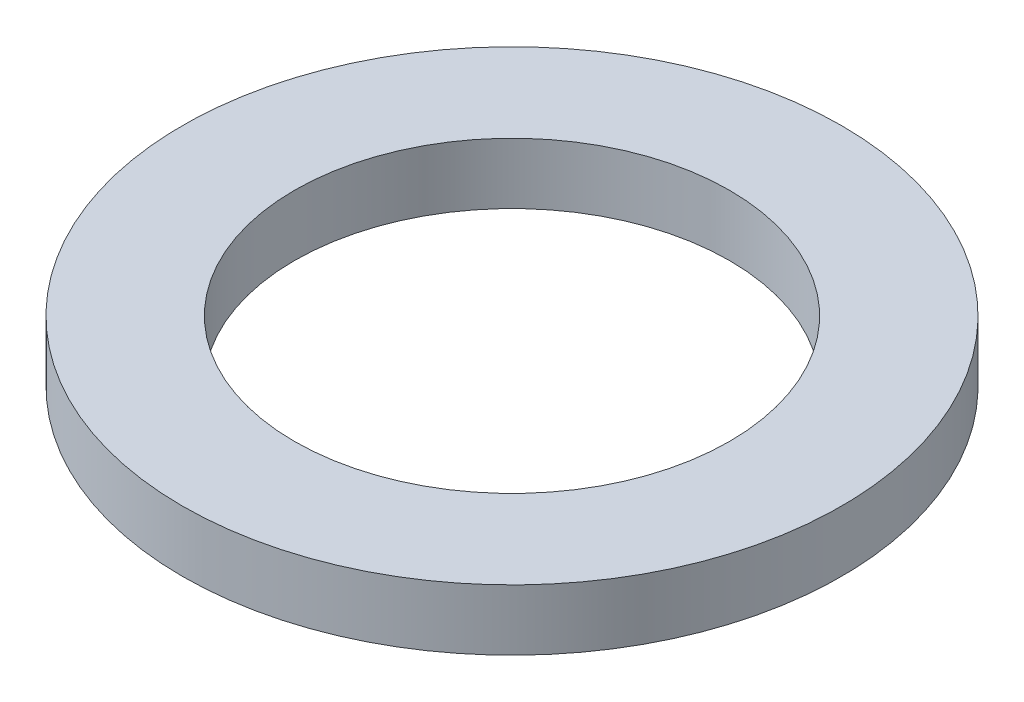
ISO-10303-21;
HEADER;
FILE_DESCRIPTION(('STEP AP214'),'2;1');
FILE_NAME('part.step','',(''),(''),'','','');
FILE_SCHEMA(('AUTOMOTIVE_DESIGN { 1 0 10303 214 1 1 1 1 }'));
ENDSEC;
DATA;
#1=APPLICATION_CONTEXT('core data for automotive mechanical design processes');
#2=APPLICATION_PROTOCOL_DEFINITION('international standard','automotive_design',2000,#1);
#3=PRODUCT_CONTEXT('',#1,'mechanical');
#4=PRODUCT('Part','Part','',(#3));
#5=PRODUCT_RELATED_PRODUCT_CATEGORY('part','',(#4));
#6=PRODUCT_DEFINITION_FORMATION('','',#4);
#7=PRODUCT_DEFINITION_CONTEXT('part definition',#1,'design');
#8=PRODUCT_DEFINITION('design','',#6,#7);
#9=PRODUCT_DEFINITION_SHAPE('','',#8);
#10=(LENGTH_UNIT() NAMED_UNIT(*) SI_UNIT(.MILLI.,.METRE.));
#11=(NAMED_UNIT(*) PLANE_ANGLE_UNIT() SI_UNIT($,.RADIAN.));
#12=(NAMED_UNIT(*) SI_UNIT($,.STERADIAN.) SOLID_ANGLE_UNIT());
#13=UNCERTAINTY_MEASURE_WITH_UNIT(LENGTH_MEASURE(1.E-05),#10,'distance_accuracy_value','');
#14=(GEOMETRIC_REPRESENTATION_CONTEXT(3) GLOBAL_UNCERTAINTY_ASSIGNED_CONTEXT((#13)) GLOBAL_UNIT_ASSIGNED_CONTEXT((#10,
#11,#12)) REPRESENTATION_CONTEXT('',''));
#15=CARTESIAN_POINT('',(0.,0.,0.));
#16=DIRECTION('',(0.,0.,1.));
#17=DIRECTION('',(1.,0.,0.));
#18=AXIS2_PLACEMENT_3D('',#15,#16,#17);
#19=CARTESIAN_POINT('',(0.,0.711200000000002,0.));
#20=DIRECTION('',(0.,-1.,0.));
#21=DIRECTION('',(0.,0.,-1.));
#22=AXIS2_PLACEMENT_3D('',#19,#20,#21);
#23=CYLINDRICAL_SURFACE('',#22,3.8481);
#24=CARTESIAN_POINT('',(0.,0.711200000000002,0.));
#25=DIRECTION('',(0.,1.,0.));
#26=DIRECTION('',(0.,0.,1.));
#27=AXIS2_PLACEMENT_3D('',#24,#25,#26);
#28=CIRCLE('',#27,3.8481);
#29=CARTESIAN_POINT('',(0.,0.711200000000002,3.84809999999999));
#30=VERTEX_POINT('',#29);
#31=EDGE_CURVE('E10',#30,#30,#28,.T.);
#32=ORIENTED_EDGE('',*,*,#31,.F.);
#33=EDGE_LOOP('',(#32));
#34=FACE_BOUND('',#33,.T.);
#35=CARTESIAN_POINT('',(0.,0.,0.));
#36=DIRECTION('',(0.,1.,0.));
#37=DIRECTION('',(0.,0.,1.));
#38=AXIS2_PLACEMENT_3D('',#35,#36,#37);
#39=CIRCLE('',#38,3.8481);
#40=CARTESIAN_POINT('',(0.,0.,3.8481));
#41=VERTEX_POINT('',#40);
#42=EDGE_CURVE('E33',#41,#41,#39,.T.);
#43=ORIENTED_EDGE('',*,*,#42,.T.);
#44=EDGE_LOOP('',(#43));
#45=FACE_BOUND('',#44,.T.);
#46=ADVANCED_FACE('F30',(#34,#45),#23,.T.);
#47=CARTESIAN_POINT('',(0.,0.711200000000002,0.));
#48=DIRECTION('',(0.,1.,0.));
#49=DIRECTION('',(0.,0.,1.));
#50=AXIS2_PLACEMENT_3D('',#47,#48,#49);
#51=PLANE('',#50);
#52=CARTESIAN_POINT('',(0.,0.711200000000002,0.));
#53=DIRECTION('',(0.,1.,0.));
#54=DIRECTION('',(0.,0.,1.));
#55=AXIS2_PLACEMENT_3D('',#52,#53,#54);
#56=CIRCLE('',#55,2.54);
#57=CARTESIAN_POINT('',(0.,0.711200000000002,2.53999999999999));
#58=VERTEX_POINT('',#57);
#59=EDGE_CURVE('E42',#58,#58,#56,.T.);
#60=ORIENTED_EDGE('',*,*,#59,.F.);
#61=EDGE_LOOP('',(#60));
#62=FACE_BOUND('',#61,.T.);
#63=ORIENTED_EDGE('',*,*,#31,.T.);
#64=EDGE_LOOP('',(#63));
#65=FACE_BOUND('',#64,.T.);
#66=ADVANCED_FACE('F57',(#62,#65),#51,.T.);
#67=CARTESIAN_POINT('',(0.,0.,0.));
#68=DIRECTION('',(0.,1.,0.));
#69=DIRECTION('',(0.,0.,1.));
#70=AXIS2_PLACEMENT_3D('',#67,#68,#69);
#71=PLANE('',#70);
#72=CARTESIAN_POINT('',(0.,0.,0.));
#73=DIRECTION('',(0.,1.,0.));
#74=DIRECTION('',(0.,0.,1.));
#75=AXIS2_PLACEMENT_3D('',#72,#73,#74);
#76=CIRCLE('',#75,2.54);
#77=CARTESIAN_POINT('',(0.,0.,2.54));
#78=VERTEX_POINT('',#77);
#79=EDGE_CURVE('E40',#78,#78,#76,.T.);
#80=ORIENTED_EDGE('',*,*,#79,.T.);
#81=EDGE_LOOP('',(#80));
#82=FACE_BOUND('',#81,.T.);
#83=ORIENTED_EDGE('',*,*,#42,.F.);
#84=EDGE_LOOP('',(#83));
#85=FACE_BOUND('',#84,.T.);
#86=ADVANCED_FACE('F48',(#82,#85),#71,.F.);
#87=CARTESIAN_POINT('',(0.,0.,0.));
#88=DIRECTION('',(0.,1.,0.));
#89=DIRECTION('',(0.,0.,1.));
#90=AXIS2_PLACEMENT_3D('',#87,#88,#89);
#91=CYLINDRICAL_SURFACE('',#90,2.54);
#92=ORIENTED_EDGE('',*,*,#79,.F.);
#93=EDGE_LOOP('',(#92));
#94=FACE_BOUND('',#93,.T.);
#95=ORIENTED_EDGE('',*,*,#59,.T.);
#96=EDGE_LOOP('',(#95));
#97=FACE_BOUND('',#96,.T.);
#98=ADVANCED_FACE('F51',(#94,#97),#91,.F.);
#99=CLOSED_SHELL('',(#46,#66,#86,#98));
#100=MANIFOLD_SOLID_BREP('B2',#99);
#101=ADVANCED_BREP_SHAPE_REPRESENTATION('',(#18,#100),#14);
#102=SHAPE_DEFINITION_REPRESENTATION(#9,#101);
ENDSEC;
END-ISO-10303-21;
